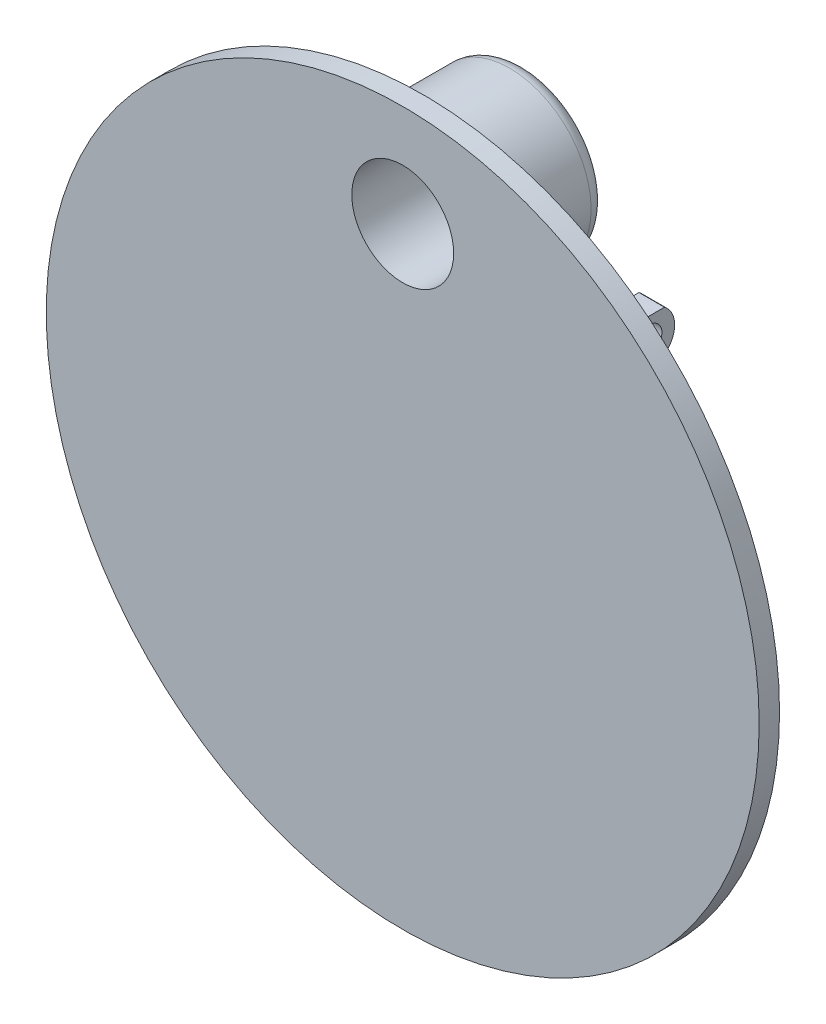
ISO-10303-21;
HEADER;
FILE_DESCRIPTION(('STEP AP214'),'2;1');
FILE_NAME('part.step','',(''),(''),'','','');
FILE_SCHEMA(('AUTOMOTIVE_DESIGN { 1 0 10303 214 1 1 1 1 }'));
ENDSEC;
DATA;
#1=APPLICATION_CONTEXT('core data for automotive mechanical design processes');
#2=APPLICATION_PROTOCOL_DEFINITION('international standard','automotive_design',2000,#1);
#3=PRODUCT_CONTEXT('',#1,'mechanical');
#4=PRODUCT('Part','Part','',(#3));
#5=PRODUCT_RELATED_PRODUCT_CATEGORY('part','',(#4));
#6=PRODUCT_DEFINITION_FORMATION('','',#4);
#7=PRODUCT_DEFINITION_CONTEXT('part definition',#1,'design');
#8=PRODUCT_DEFINITION('design','',#6,#7);
#9=PRODUCT_DEFINITION_SHAPE('','',#8);
#10=(LENGTH_UNIT() NAMED_UNIT(*) SI_UNIT(.MILLI.,.METRE.));
#11=(NAMED_UNIT(*) PLANE_ANGLE_UNIT() SI_UNIT($,.RADIAN.));
#12=(NAMED_UNIT(*) SI_UNIT($,.STERADIAN.) SOLID_ANGLE_UNIT());
#13=UNCERTAINTY_MEASURE_WITH_UNIT(LENGTH_MEASURE(1.E-05),#10,'distance_accuracy_value','');
#14=(GEOMETRIC_REPRESENTATION_CONTEXT(3) GLOBAL_UNCERTAINTY_ASSIGNED_CONTEXT((#13)) GLOBAL_UNIT_ASSIGNED_CONTEXT((#10,
#11,#12)) REPRESENTATION_CONTEXT('',''));
#15=CARTESIAN_POINT('',(0.,0.,0.));
#16=DIRECTION('',(0.,0.,1.));
#17=DIRECTION('',(1.,0.,0.));
#18=AXIS2_PLACEMENT_3D('',#15,#16,#17);
#19=CARTESIAN_POINT('',(0.,0.,0.));
#20=DIRECTION('',(0.,0.,1.));
#21=DIRECTION('',(1.,0.,0.));
#22=AXIS2_PLACEMENT_3D('',#19,#20,#21);
#23=PLANE('',#22);
#24=DIRECTION('',(1.,0.,0.));
#25=VECTOR('',#24,1.);
#26=CARTESIAN_POINT('',(-10.7000000000118,15.769174863896,0.));
#27=LINE('',#26,#25);
#28=CARTESIAN_POINT('',(-10.7000000000118,15.769174863896,0.));
#29=VERTEX_POINT('',#28);
#30=CARTESIAN_POINT('',(-8.20000000001177,15.769174863896,0.));
#31=VERTEX_POINT('',#30);
#32=EDGE_CURVE('E62',#29,#31,#27,.T.);
#33=ORIENTED_EDGE('',*,*,#32,.F.);
#34=DIRECTION('',(0.,1.,0.));
#35=VECTOR('',#34,1.);
#36=CARTESIAN_POINT('',(-10.7000000000118,11.769174863896,0.));
#37=LINE('',#36,#35);
#38=CARTESIAN_POINT('',(-10.7000000000118,11.769174863896,0.));
#39=VERTEX_POINT('',#38);
#40=EDGE_CURVE('E57',#39,#29,#37,.T.);
#41=ORIENTED_EDGE('',*,*,#40,.F.);
#42=DIRECTION('',(1.,0.,0.));
#43=VECTOR('',#42,1.);
#44=CARTESIAN_POINT('',(-10.7000000000118,11.769174863896,0.));
#45=LINE('',#44,#43);
#46=CARTESIAN_POINT('',(-8.20000000001178,11.769174863896,0.));
#47=VERTEX_POINT('',#46);
#48=EDGE_CURVE('E112',#39,#47,#45,.T.);
#49=ORIENTED_EDGE('',*,*,#48,.T.);
#50=DIRECTION('',(0.,1.,0.));
#51=VECTOR('',#50,1.);
#52=CARTESIAN_POINT('',(-8.20000000001178,11.769174863896,0.));
#53=LINE('',#52,#51);
#54=EDGE_CURVE('E279',#47,#31,#53,.T.);
#55=ORIENTED_EDGE('',*,*,#54,.T.);
#56=EDGE_LOOP('',(#33,#41,#49,#55));
#57=FACE_BOUND('',#56,.T.);
#58=CARTESIAN_POINT('',(0.,25.,0.));
#59=DIRECTION('',(0.,0.,1.));
#60=DIRECTION('',(1.,0.,0.));
#61=AXIS2_PLACEMENT_3D('',#58,#59,#60);
#62=CIRCLE('',#61,8.);
#63=CARTESIAN_POINT('',(8.,25.,0.));
#64=VERTEX_POINT('',#63);
#65=EDGE_CURVE('E170',#64,#64,#62,.F.);
#66=ORIENTED_EDGE('',*,*,#65,.F.);
#67=EDGE_LOOP('',(#66));
#68=FACE_BOUND('',#67,.T.);
#69=CARTESIAN_POINT('',(0.,0.,0.));
#70=DIRECTION('',(0.,0.,1.));
#71=DIRECTION('',(1.,0.,0.));
#72=AXIS2_PLACEMENT_3D('',#69,#70,#71);
#73=CIRCLE('',#72,35.);
#74=CARTESIAN_POINT('',(35.,0.,0.));
#75=VERTEX_POINT('',#74);
#76=EDGE_CURVE('E166',#75,#75,#73,.T.);
#77=ORIENTED_EDGE('',*,*,#76,.F.);
#78=EDGE_LOOP('',(#77));
#79=FACE_BOUND('',#78,.T.);
#80=DIRECTION('',(0.,-1.,0.));
#81=VECTOR('',#80,1.);
#82=CARTESIAN_POINT('',(10.6999999999882,15.769174863896,0.));
#83=LINE('',#82,#81);
#84=CARTESIAN_POINT('',(10.6999999999882,15.769174863896,0.));
#85=VERTEX_POINT('',#84);
#86=CARTESIAN_POINT('',(10.6999999999882,11.7691748638959,0.));
#87=VERTEX_POINT('',#86);
#88=EDGE_CURVE('E142',#85,#87,#83,.T.);
#89=ORIENTED_EDGE('',*,*,#88,.F.);
#90=DIRECTION('',(-1.,0.,0.));
#91=VECTOR('',#90,1.);
#92=CARTESIAN_POINT('',(10.6999999999882,15.769174863896,0.));
#93=LINE('',#92,#91);
#94=CARTESIAN_POINT('',(8.19999999998823,15.769174863896,0.));
#95=VERTEX_POINT('',#94);
#96=EDGE_CURVE('E157',#85,#95,#93,.T.);
#97=ORIENTED_EDGE('',*,*,#96,.T.);
#98=DIRECTION('',(0.,-1.,0.));
#99=VECTOR('',#98,1.);
#100=CARTESIAN_POINT('',(8.19999999998823,15.769174863896,0.));
#101=LINE('',#100,#99);
#102=CARTESIAN_POINT('',(8.19999999998823,11.7691748638959,0.));
#103=VERTEX_POINT('',#102);
#104=EDGE_CURVE('E148',#95,#103,#101,.T.);
#105=ORIENTED_EDGE('',*,*,#104,.T.);
#106=DIRECTION('',(-1.,0.,0.));
#107=VECTOR('',#106,1.);
#108=CARTESIAN_POINT('',(10.6999999999882,11.7691748638959,0.));
#109=LINE('',#108,#107);
#110=EDGE_CURVE('E154',#87,#103,#109,.T.);
#111=ORIENTED_EDGE('',*,*,#110,.F.);
#112=EDGE_LOOP('',(#89,#97,#105,#111));
#113=FACE_BOUND('',#112,.T.);
#114=ADVANCED_FACE('F41',(#57,#68,#79,#113),#23,.F.);
#115=CARTESIAN_POINT('',(0.,0.,2.));
#116=DIRECTION('',(0.,0.,-1.));
#117=DIRECTION('',(-1.,0.,0.));
#118=AXIS2_PLACEMENT_3D('',#115,#116,#117);
#119=CYLINDRICAL_SURFACE('',#118,35.);
#120=CARTESIAN_POINT('',(0.,0.,2.));
#121=DIRECTION('',(0.,0.,1.));
#122=DIRECTION('',(1.,0.,0.));
#123=AXIS2_PLACEMENT_3D('',#120,#121,#122);
#124=CIRCLE('',#123,35.);
#125=CARTESIAN_POINT('',(35.,0.,2.));
#126=VERTEX_POINT('',#125);
#127=EDGE_CURVE('E167',#126,#126,#124,.T.);
#128=ORIENTED_EDGE('',*,*,#127,.F.);
#129=EDGE_LOOP('',(#128));
#130=FACE_BOUND('',#129,.T.);
#131=ORIENTED_EDGE('',*,*,#76,.T.);
#132=EDGE_LOOP('',(#131));
#133=FACE_BOUND('',#132,.T.);
#134=ADVANCED_FACE('F203',(#130,#133),#119,.T.);
#135=CARTESIAN_POINT('',(0.,0.,2.));
#136=DIRECTION('',(0.,0.,1.));
#137=DIRECTION('',(1.,0.,0.));
#138=AXIS2_PLACEMENT_3D('',#135,#136,#137);
#139=PLANE('',#138);
#140=CARTESIAN_POINT('',(0.,25.,2.));
#141=DIRECTION('',(0.,0.,1.));
#142=DIRECTION('',(1.,0.,0.));
#143=AXIS2_PLACEMENT_3D('',#140,#141,#142);
#144=CIRCLE('',#143,5.);
#145=CARTESIAN_POINT('',(5.,25.,2.));
#146=VERTEX_POINT('',#145);
#147=EDGE_CURVE('E163',#146,#146,#144,.T.);
#148=ORIENTED_EDGE('',*,*,#147,.F.);
#149=EDGE_LOOP('',(#148));
#150=FACE_BOUND('',#149,.T.);
#151=ORIENTED_EDGE('',*,*,#127,.T.);
#152=EDGE_LOOP('',(#151));
#153=FACE_BOUND('',#152,.T.);
#154=ADVANCED_FACE('F210',(#150,#153),#139,.T.);
#155=CARTESIAN_POINT('',(0.,25.,0.));
#156=DIRECTION('',(0.,0.,1.));
#157=DIRECTION('',(1.,0.,0.));
#158=AXIS2_PLACEMENT_3D('',#155,#156,#157);
#159=CYLINDRICAL_SURFACE('',#158,5.);
#160=CARTESIAN_POINT('',(0.,25.,-9.25));
#161=DIRECTION('',(0.,0.,-1.));
#162=DIRECTION('',(-1.,0.,0.));
#163=AXIS2_PLACEMENT_3D('',#160,#161,#162);
#164=CIRCLE('',#163,5.);
#165=CARTESIAN_POINT('',(-5.,25.,-9.25));
#166=VERTEX_POINT('',#165);
#167=EDGE_CURVE('E175',#166,#166,#164,.T.);
#168=ORIENTED_EDGE('',*,*,#167,.T.);
#169=EDGE_LOOP('',(#168));
#170=FACE_BOUND('',#169,.T.);
#171=ORIENTED_EDGE('',*,*,#147,.T.);
#172=EDGE_LOOP('',(#171));
#173=FACE_BOUND('',#172,.T.);
#174=ADVANCED_FACE('F217',(#170,#173),#159,.F.);
#175=CARTESIAN_POINT('',(0.,25.,-10.));
#176=DIRECTION('',(0.,0.,-1.));
#177=DIRECTION('',(-1.,0.,0.));
#178=AXIS2_PLACEMENT_3D('',#175,#176,#177);
#179=PLANE('',#178);
#180=CARTESIAN_POINT('',(0.,25.,-10.));
#181=DIRECTION('',(0.,0.,-1.));
#182=DIRECTION('',(-1.,0.,0.));
#183=AXIS2_PLACEMENT_3D('',#180,#181,#182);
#184=CIRCLE('',#183,6.5);
#185=CARTESIAN_POINT('',(-6.5,25.,-10.));
#186=VERTEX_POINT('',#185);
#187=EDGE_CURVE('E50',#186,#186,#184,.T.);
#188=ORIENTED_EDGE('',*,*,#187,.T.);
#189=EDGE_LOOP('',(#188));
#190=FACE_BOUND('',#189,.T.);
#191=CARTESIAN_POINT('',(0.,25.,-10.));
#192=DIRECTION('',(0.,0.,-1.));
#193=DIRECTION('',(-1.,0.,0.));
#194=AXIS2_PLACEMENT_3D('',#191,#192,#193);
#195=CIRCLE('',#194,5.75);
#196=CARTESIAN_POINT('',(-5.75,25.,-10.));
#197=VERTEX_POINT('',#196);
#198=EDGE_CURVE('E178',#197,#197,#195,.F.);
#199=ORIENTED_EDGE('',*,*,#198,.T.);
#200=EDGE_LOOP('',(#199));
#201=FACE_BOUND('',#200,.T.);
#202=ADVANCED_FACE('F184',(#190,#201),#179,.T.);
#203=CARTESIAN_POINT('',(0.,25.,-10.));
#204=DIRECTION('',(0.,0.,1.));
#205=DIRECTION('',(1.,0.,0.));
#206=AXIS2_PLACEMENT_3D('',#203,#204,#205);
#207=CYLINDRICAL_SURFACE('',#206,8.);
#208=CARTESIAN_POINT('',(0.,25.,-8.5));
#209=DIRECTION('',(0.,0.,-1.));
#210=DIRECTION('',(-1.,0.,0.));
#211=AXIS2_PLACEMENT_3D('',#208,#209,#210);
#212=CIRCLE('',#211,8.);
#213=CARTESIAN_POINT('',(-8.,25.,-8.5));
#214=VERTEX_POINT('',#213);
#215=EDGE_CURVE('E11',#214,#214,#212,.F.);
#216=ORIENTED_EDGE('',*,*,#215,.T.);
#217=EDGE_LOOP('',(#216));
#218=FACE_BOUND('',#217,.T.);
#219=ORIENTED_EDGE('',*,*,#65,.T.);
#220=EDGE_LOOP('',(#219));
#221=FACE_BOUND('',#220,.T.);
#222=ADVANCED_FACE('F199',(#218,#221),#207,.T.);
#223=CARTESIAN_POINT('',(0.,25.,-9.25));
#224=DIRECTION('',(0.,0.,-1.));
#225=DIRECTION('',(-1.,0.,0.));
#226=AXIS2_PLACEMENT_3D('',#223,#224,#225);
#227=TOROIDAL_SURFACE('',#226,5.75,0.75);
#228=ORIENTED_EDGE('',*,*,#198,.F.);
#229=EDGE_LOOP('',(#228));
#230=FACE_BOUND('',#229,.T.);
#231=ORIENTED_EDGE('',*,*,#167,.F.);
#232=EDGE_LOOP('',(#231));
#233=FACE_BOUND('',#232,.T.);
#234=ADVANCED_FACE('F189',(#230,#233),#227,.T.);
#235=CARTESIAN_POINT('',(0.,25.,-8.5));
#236=DIRECTION('',(0.,0.,-1.));
#237=DIRECTION('',(-1.,0.,0.));
#238=AXIS2_PLACEMENT_3D('',#235,#236,#237);
#239=TOROIDAL_SURFACE('',#238,6.5,1.5);
#240=ORIENTED_EDGE('',*,*,#215,.F.);
#241=EDGE_LOOP('',(#240));
#242=FACE_BOUND('',#241,.T.);
#243=ORIENTED_EDGE('',*,*,#187,.F.);
#244=EDGE_LOOP('',(#243));
#245=FACE_BOUND('',#244,.T.);
#246=ADVANCED_FACE('F43',(#242,#245),#239,.T.);
#247=CARTESIAN_POINT('',(10.6999999999882,13.769174863896,-11.5));
#248=DIRECTION('',(-1.,0.,0.));
#249=DIRECTION('',(0.,-1.,0.));
#250=AXIS2_PLACEMENT_3D('',#247,#248,#249);
#251=CYLINDRICAL_SURFACE('',#250,2.5);
#252=CARTESIAN_POINT('',(8.19999999998823,13.769174863896,-11.5));
#253=DIRECTION('',(1.,0.,0.));
#254=DIRECTION('',(0.,-1.,0.));
#255=AXIS2_PLACEMENT_3D('',#252,#253,#254);
#256=CIRCLE('',#255,2.5);
#257=CARTESIAN_POINT('',(8.19999999998823,11.7691748638959,-10.));
#258=VERTEX_POINT('',#257);
#259=CARTESIAN_POINT('',(8.19999999998823,15.769174863896,-13.));
#260=VERTEX_POINT('',#259);
#261=EDGE_CURVE('E128',#258,#260,#256,.T.);
#262=ORIENTED_EDGE('',*,*,#261,.T.);
#263=DIRECTION('',(-1.,0.,0.));
#264=VECTOR('',#263,1.);
#265=CARTESIAN_POINT('',(10.6999999999882,15.769174863896,-13.));
#266=LINE('',#265,#264);
#267=CARTESIAN_POINT('',(10.6999999999882,15.769174863896,-13.));
#268=VERTEX_POINT('',#267);
#269=EDGE_CURVE('E160',#268,#260,#266,.T.);
#270=ORIENTED_EDGE('',*,*,#269,.F.);
#271=CARTESIAN_POINT('',(10.6999999999882,13.769174863896,-11.5));
#272=DIRECTION('',(1.,0.,0.));
#273=DIRECTION('',(0.,-1.,0.));
#274=AXIS2_PLACEMENT_3D('',#271,#272,#273);
#275=CIRCLE('',#274,2.5);
#276=CARTESIAN_POINT('',(10.6999999999882,11.7691748638959,-10.));
#277=VERTEX_POINT('',#276);
#278=EDGE_CURVE('E136',#277,#268,#275,.T.);
#279=ORIENTED_EDGE('',*,*,#278,.F.);
#280=DIRECTION('',(-1.,0.,0.));
#281=VECTOR('',#280,1.);
#282=CARTESIAN_POINT('',(10.6999999999882,11.7691748638959,-10.));
#283=LINE('',#282,#281);
#284=EDGE_CURVE('E145',#277,#258,#283,.T.);
#285=ORIENTED_EDGE('',*,*,#284,.T.);
#286=EDGE_LOOP('',(#262,#270,#279,#285));
#287=FACE_BOUND('',#286,.T.);
#288=ADVANCED_FACE('F188',(#287),#251,.T.);
#289=CARTESIAN_POINT('',(10.6999999999882,15.769174863896,-13.));
#290=DIRECTION('',(0.,-1.,0.));
#291=DIRECTION('',(1.,0.,0.));
#292=AXIS2_PLACEMENT_3D('',#289,#290,#291);
#293=PLANE('',#292);
#294=DIRECTION('',(0.,0.,1.));
#295=VECTOR('',#294,1.);
#296=CARTESIAN_POINT('',(8.19999999998823,15.769174863896,-13.));
#297=LINE('',#296,#295);
#298=EDGE_CURVE('E131',#260,#95,#297,.T.);
#299=ORIENTED_EDGE('',*,*,#298,.T.);
#300=ORIENTED_EDGE('',*,*,#96,.F.);
#301=DIRECTION('',(0.,0.,1.));
#302=VECTOR('',#301,1.);
#303=CARTESIAN_POINT('',(10.6999999999882,15.769174863896,-13.));
#304=LINE('',#303,#302);
#305=EDGE_CURVE('E139',#268,#85,#304,.T.);
#306=ORIENTED_EDGE('',*,*,#305,.F.);
#307=ORIENTED_EDGE('',*,*,#269,.T.);
#308=EDGE_LOOP('',(#299,#300,#306,#307));
#309=FACE_BOUND('',#308,.T.);
#310=ADVANCED_FACE('F195',(#309),#293,.F.);
#311=CARTESIAN_POINT('',(10.6999999999882,11.7691748638959,0.));
#312=DIRECTION('',(0.,1.,0.));
#313=DIRECTION('',(-1.,0.,0.));
#314=AXIS2_PLACEMENT_3D('',#311,#312,#313);
#315=PLANE('',#314);
#316=DIRECTION('',(0.,0.,-1.));
#317=VECTOR('',#316,1.);
#318=CARTESIAN_POINT('',(8.19999999998823,11.7691748638959,0.));
#319=LINE('',#318,#317);
#320=EDGE_CURVE('E140',#103,#258,#319,.T.);
#321=ORIENTED_EDGE('',*,*,#320,.T.);
#322=ORIENTED_EDGE('',*,*,#284,.F.);
#323=DIRECTION('',(0.,0.,-1.));
#324=VECTOR('',#323,1.);
#325=CARTESIAN_POINT('',(10.6999999999882,11.7691748638959,0.));
#326=LINE('',#325,#324);
#327=EDGE_CURVE('E144',#87,#277,#326,.T.);
#328=ORIENTED_EDGE('',*,*,#327,.F.);
#329=ORIENTED_EDGE('',*,*,#110,.T.);
#330=EDGE_LOOP('',(#321,#322,#328,#329));
#331=FACE_BOUND('',#330,.T.);
#332=ADVANCED_FACE('F228',(#331),#315,.F.);
#333=CARTESIAN_POINT('',(10.6999999999882,13.769174863896,-11.5));
#334=DIRECTION('',(-1.,0.,0.));
#335=DIRECTION('',(0.,-1.,0.));
#336=AXIS2_PLACEMENT_3D('',#333,#334,#335);
#337=PLANE('',#336);
#338=CARTESIAN_POINT('',(10.6999999999882,13.769174863896,-11.5));
#339=DIRECTION('',(-1.,0.,0.));
#340=DIRECTION('',(0.,-1.,0.));
#341=AXIS2_PLACEMENT_3D('',#338,#339,#340);
#342=CIRCLE('',#341,1.24999999999558);
#343=CARTESIAN_POINT('',(10.6999999999882,12.5191748639004,-11.5));
#344=VERTEX_POINT('',#343);
#345=EDGE_CURVE('E268',#344,#344,#342,.T.);
#346=ORIENTED_EDGE('',*,*,#345,.T.);
#347=EDGE_LOOP('',(#346));
#348=FACE_BOUND('',#347,.T.);
#349=ORIENTED_EDGE('',*,*,#278,.T.);
#350=ORIENTED_EDGE('',*,*,#305,.T.);
#351=ORIENTED_EDGE('',*,*,#88,.T.);
#352=ORIENTED_EDGE('',*,*,#327,.T.);
#353=EDGE_LOOP('',(#349,#350,#351,#352));
#354=FACE_BOUND('',#353,.T.);
#355=ADVANCED_FACE('F231',(#348,#354),#337,.F.);
#356=CARTESIAN_POINT('',(8.19999999998823,13.769174863896,-11.5));
#357=DIRECTION('',(-1.,0.,0.));
#358=DIRECTION('',(0.,-1.,0.));
#359=AXIS2_PLACEMENT_3D('',#356,#357,#358);
#360=PLANE('',#359);
#361=CARTESIAN_POINT('',(8.19999999998823,13.769174863896,-11.5));
#362=DIRECTION('',(-1.,0.,0.));
#363=DIRECTION('',(0.,-1.,0.));
#364=AXIS2_PLACEMENT_3D('',#361,#362,#363);
#365=CIRCLE('',#364,1.24999999999558);
#366=CARTESIAN_POINT('',(8.19999999998823,12.5191748639004,-11.5));
#367=VERTEX_POINT('',#366);
#368=EDGE_CURVE('E265',#367,#367,#365,.T.);
#369=ORIENTED_EDGE('',*,*,#368,.F.);
#370=EDGE_LOOP('',(#369));
#371=FACE_BOUND('',#370,.T.);
#372=ORIENTED_EDGE('',*,*,#261,.F.);
#373=ORIENTED_EDGE('',*,*,#320,.F.);
#374=ORIENTED_EDGE('',*,*,#104,.F.);
#375=ORIENTED_EDGE('',*,*,#298,.F.);
#376=EDGE_LOOP('',(#372,#373,#374,#375));
#377=FACE_BOUND('',#376,.T.);
#378=ADVANCED_FACE('F233',(#371,#377),#360,.T.);
#379=CARTESIAN_POINT('',(-10.7000000000118,13.769174863896,-11.5));
#380=DIRECTION('',(1.,0.,0.));
#381=DIRECTION('',(0.,1.,0.));
#382=AXIS2_PLACEMENT_3D('',#379,#380,#381);
#383=CYLINDRICAL_SURFACE('',#382,2.5);
#384=CARTESIAN_POINT('',(-8.20000000001178,13.769174863896,-11.5));
#385=DIRECTION('',(-1.,0.,0.));
#386=DIRECTION('',(0.,-1.,0.));
#387=AXIS2_PLACEMENT_3D('',#384,#385,#386);
#388=CIRCLE('',#387,2.5);
#389=CARTESIAN_POINT('',(-8.20000000001177,15.769174863896,-13.));
#390=VERTEX_POINT('',#389);
#391=CARTESIAN_POINT('',(-8.20000000001178,11.769174863896,-10.));
#392=VERTEX_POINT('',#391);
#393=EDGE_CURVE('E127',#390,#392,#388,.T.);
#394=ORIENTED_EDGE('',*,*,#393,.T.);
#395=DIRECTION('',(1.,0.,0.));
#396=VECTOR('',#395,1.);
#397=CARTESIAN_POINT('',(-10.7000000000118,11.769174863896,-10.));
#398=LINE('',#397,#396);
#399=CARTESIAN_POINT('',(-10.7000000000118,11.769174863896,-10.));
#400=VERTEX_POINT('',#399);
#401=EDGE_CURVE('E110',#400,#392,#398,.T.);
#402=ORIENTED_EDGE('',*,*,#401,.F.);
#403=CARTESIAN_POINT('',(-10.7000000000118,13.769174863896,-11.5));
#404=DIRECTION('',(-1.,0.,0.));
#405=DIRECTION('',(0.,-1.,0.));
#406=AXIS2_PLACEMENT_3D('',#403,#404,#405);
#407=CIRCLE('',#406,2.5);
#408=CARTESIAN_POINT('',(-10.7000000000118,15.769174863896,-13.));
#409=VERTEX_POINT('',#408);
#410=EDGE_CURVE('E114',#409,#400,#407,.T.);
#411=ORIENTED_EDGE('',*,*,#410,.F.);
#412=DIRECTION('',(1.,0.,0.));
#413=VECTOR('',#412,1.);
#414=CARTESIAN_POINT('',(-10.7000000000118,15.769174863896,-13.));
#415=LINE('',#414,#413);
#416=EDGE_CURVE('E276',#409,#390,#415,.T.);
#417=ORIENTED_EDGE('',*,*,#416,.T.);
#418=EDGE_LOOP('',(#394,#402,#411,#417));
#419=FACE_BOUND('',#418,.T.);
#420=ADVANCED_FACE('F125',(#419),#383,.T.);
#421=CARTESIAN_POINT('',(-10.7000000000118,11.769174863896,-10.));
#422=DIRECTION('',(0.,1.,0.));
#423=DIRECTION('',(-1.,0.,0.));
#424=AXIS2_PLACEMENT_3D('',#421,#422,#423);
#425=PLANE('',#424);
#426=DIRECTION('',(0.,0.,1.));
#427=VECTOR('',#426,1.);
#428=CARTESIAN_POINT('',(-8.20000000001178,11.769174863896,-10.));
#429=LINE('',#428,#427);
#430=EDGE_CURVE('E270',#392,#47,#429,.T.);
#431=ORIENTED_EDGE('',*,*,#430,.T.);
#432=ORIENTED_EDGE('',*,*,#48,.F.);
#433=DIRECTION('',(0.,0.,1.));
#434=VECTOR('',#433,1.);
#435=CARTESIAN_POINT('',(-10.7000000000118,11.769174863896,-10.));
#436=LINE('',#435,#434);
#437=EDGE_CURVE('E105',#400,#39,#436,.T.);
#438=ORIENTED_EDGE('',*,*,#437,.F.);
#439=ORIENTED_EDGE('',*,*,#401,.T.);
#440=EDGE_LOOP('',(#431,#432,#438,#439));
#441=FACE_BOUND('',#440,.T.);
#442=ADVANCED_FACE('F108',(#441),#425,.F.);
#443=CARTESIAN_POINT('',(-10.7000000000118,15.769174863896,0.));
#444=DIRECTION('',(0.,-1.,0.));
#445=DIRECTION('',(1.,0.,0.));
#446=AXIS2_PLACEMENT_3D('',#443,#444,#445);
#447=PLANE('',#446);
#448=DIRECTION('',(0.,0.,-1.));
#449=VECTOR('',#448,1.);
#450=CARTESIAN_POINT('',(-8.20000000001177,15.769174863896,0.));
#451=LINE('',#450,#449);
#452=EDGE_CURVE('E123',#31,#390,#451,.T.);
#453=ORIENTED_EDGE('',*,*,#452,.T.);
#454=ORIENTED_EDGE('',*,*,#416,.F.);
#455=DIRECTION('',(0.,0.,-1.));
#456=VECTOR('',#455,1.);
#457=CARTESIAN_POINT('',(-10.7000000000118,15.769174863896,0.));
#458=LINE('',#457,#456);
#459=EDGE_CURVE('E119',#29,#409,#458,.T.);
#460=ORIENTED_EDGE('',*,*,#459,.F.);
#461=ORIENTED_EDGE('',*,*,#32,.T.);
#462=EDGE_LOOP('',(#453,#454,#460,#461));
#463=FACE_BOUND('',#462,.T.);
#464=ADVANCED_FACE('F243',(#463),#447,.F.);
#465=CARTESIAN_POINT('',(-10.7000000000118,13.769174863896,-11.5));
#466=DIRECTION('',(-1.,0.,0.));
#467=DIRECTION('',(0.,-1.,0.));
#468=AXIS2_PLACEMENT_3D('',#465,#466,#467);
#469=PLANE('',#468);
#470=CARTESIAN_POINT('',(-10.7000000000118,13.769174863896,-11.5));
#471=DIRECTION('',(-1.,0.,0.));
#472=DIRECTION('',(0.,-1.,0.));
#473=AXIS2_PLACEMENT_3D('',#470,#471,#472);
#474=CIRCLE('',#473,1.24999999999558);
#475=CARTESIAN_POINT('',(-10.7000000000118,12.5191748639004,-11.5));
#476=VERTEX_POINT('',#475);
#477=EDGE_CURVE('E285',#476,#476,#474,.T.);
#478=ORIENTED_EDGE('',*,*,#477,.F.);
#479=EDGE_LOOP('',(#478));
#480=FACE_BOUND('',#479,.T.);
#481=ORIENTED_EDGE('',*,*,#410,.T.);
#482=ORIENTED_EDGE('',*,*,#437,.T.);
#483=ORIENTED_EDGE('',*,*,#40,.T.);
#484=ORIENTED_EDGE('',*,*,#459,.T.);
#485=EDGE_LOOP('',(#481,#482,#483,#484));
#486=FACE_BOUND('',#485,.T.);
#487=ADVANCED_FACE('F117',(#480,#486),#469,.T.);
#488=CARTESIAN_POINT('',(-8.20000000001178,13.769174863896,-11.5));
#489=DIRECTION('',(-1.,0.,0.));
#490=DIRECTION('',(0.,-1.,0.));
#491=AXIS2_PLACEMENT_3D('',#488,#489,#490);
#492=PLANE('',#491);
#493=CARTESIAN_POINT('',(-8.20000000001177,13.769174863896,-11.5));
#494=DIRECTION('',(-1.,0.,0.));
#495=DIRECTION('',(0.,-1.,0.));
#496=AXIS2_PLACEMENT_3D('',#493,#494,#495);
#497=CIRCLE('',#496,1.24999999999558);
#498=CARTESIAN_POINT('',(-8.20000000001177,12.5191748639004,-11.5));
#499=VERTEX_POINT('',#498);
#500=EDGE_CURVE('E45',#499,#499,#497,.T.);
#501=ORIENTED_EDGE('',*,*,#500,.T.);
#502=EDGE_LOOP('',(#501));
#503=FACE_BOUND('',#502,.T.);
#504=ORIENTED_EDGE('',*,*,#393,.F.);
#505=ORIENTED_EDGE('',*,*,#452,.F.);
#506=ORIENTED_EDGE('',*,*,#54,.F.);
#507=ORIENTED_EDGE('',*,*,#430,.F.);
#508=EDGE_LOOP('',(#504,#505,#506,#507));
#509=FACE_BOUND('',#508,.T.);
#510=ADVANCED_FACE('F247',(#503,#509),#492,.F.);
#511=CARTESIAN_POINT('',(35.,13.7691748638959,-11.5));
#512=DIRECTION('',(-1.,0.,0.));
#513=DIRECTION('',(0.,-1.,0.));
#514=AXIS2_PLACEMENT_3D('',#511,#512,#513);
#515=CYLINDRICAL_SURFACE('',#514,1.24999999999558);
#516=ORIENTED_EDGE('',*,*,#477,.T.);
#517=EDGE_LOOP('',(#516));
#518=FACE_BOUND('',#517,.T.);
#519=ORIENTED_EDGE('',*,*,#500,.F.);
#520=EDGE_LOOP('',(#519));
#521=FACE_BOUND('',#520,.T.);
#522=ADVANCED_FACE('F250',(#518,#521),#515,.F.);
#523=ORIENTED_EDGE('',*,*,#368,.T.);
#524=EDGE_LOOP('',(#523));
#525=FACE_BOUND('',#524,.T.);
#526=ORIENTED_EDGE('',*,*,#345,.F.);
#527=EDGE_LOOP('',(#526));
#528=FACE_BOUND('',#527,.T.);
#529=ADVANCED_FACE('F255',(#525,#528),#515,.F.);
#530=CLOSED_SHELL('',(#114,#134,#154,#174,#202,#222,#234,#246,#288,#310,#332,#355,#378,#420,
#442,#464,#487,#510,#522,#529));
#531=MANIFOLD_SOLID_BREP('B2',#530);
#532=ADVANCED_BREP_SHAPE_REPRESENTATION('',(#18,#531),#14);
#533=SHAPE_DEFINITION_REPRESENTATION(#9,#532);
ENDSEC;
END-ISO-10303-21;
